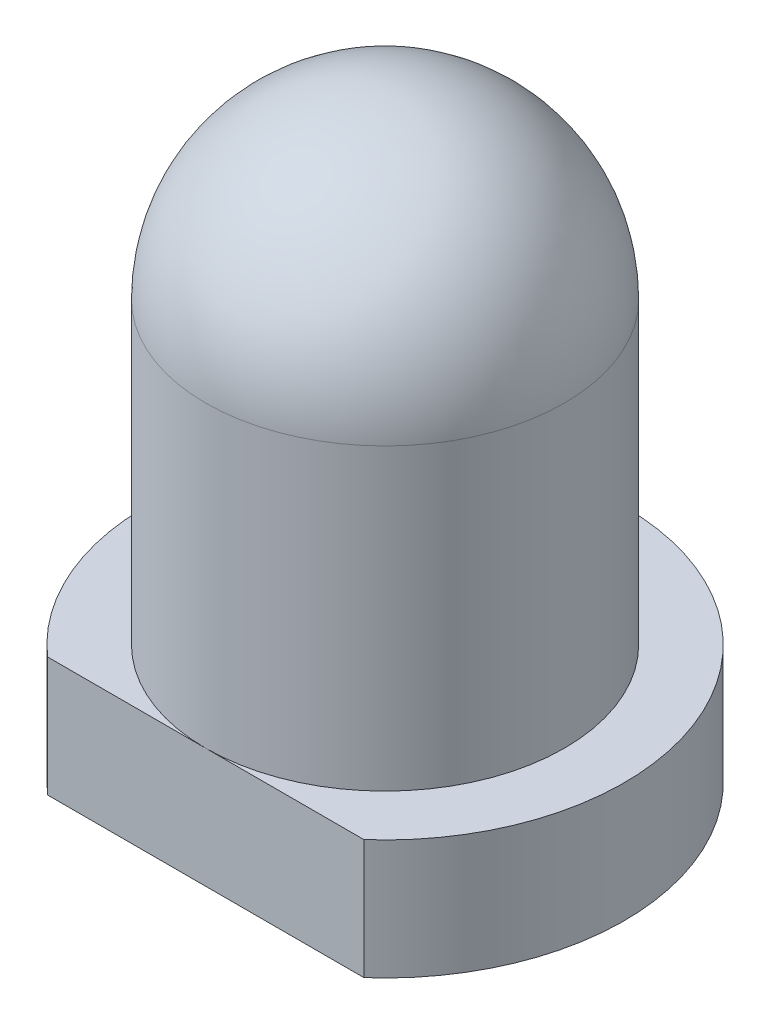
ISO-10303-21;
HEADER;
FILE_DESCRIPTION(('STEP AP214'),'2;1');
FILE_NAME('part.step','',(''),(''),'','','');
FILE_SCHEMA(('AUTOMOTIVE_DESIGN { 1 0 10303 214 1 1 1 1 }'));
ENDSEC;
DATA;
#1=APPLICATION_CONTEXT('core data for automotive mechanical design processes');
#2=APPLICATION_PROTOCOL_DEFINITION('international standard','automotive_design',2000,#1);
#3=PRODUCT_CONTEXT('',#1,'mechanical');
#4=PRODUCT('Part','Part','',(#3));
#5=PRODUCT_RELATED_PRODUCT_CATEGORY('part','',(#4));
#6=PRODUCT_DEFINITION_FORMATION('','',#4);
#7=PRODUCT_DEFINITION_CONTEXT('part definition',#1,'design');
#8=PRODUCT_DEFINITION('design','',#6,#7);
#9=PRODUCT_DEFINITION_SHAPE('','',#8);
#10=(LENGTH_UNIT() NAMED_UNIT(*) SI_UNIT(.MILLI.,.METRE.));
#11=(NAMED_UNIT(*) PLANE_ANGLE_UNIT() SI_UNIT($,.RADIAN.));
#12=(NAMED_UNIT(*) SI_UNIT($,.STERADIAN.) SOLID_ANGLE_UNIT());
#13=UNCERTAINTY_MEASURE_WITH_UNIT(LENGTH_MEASURE(1.E-05),#10,'distance_accuracy_value','');
#14=(GEOMETRIC_REPRESENTATION_CONTEXT(3) GLOBAL_UNCERTAINTY_ASSIGNED_CONTEXT((#13)) GLOBAL_UNIT_ASSIGNED_CONTEXT((#10,
#11,#12)) REPRESENTATION_CONTEXT('',''));
#15=CARTESIAN_POINT('',(0.,0.,0.));
#16=DIRECTION('',(0.,0.,1.));
#17=DIRECTION('',(1.,0.,0.));
#18=AXIS2_PLACEMENT_3D('',#15,#16,#17);
#19=CARTESIAN_POINT('',(0.,5.,0.));
#20=DIRECTION('',(0.,-1.,0.));
#21=DIRECTION('',(0.,0.,-1.));
#22=AXIS2_PLACEMENT_3D('',#19,#20,#21);
#23=CYLINDRICAL_SURFACE('',#22,1.5);
#24=CARTESIAN_POINT('',(0.,1.,0.));
#25=DIRECTION('',(0.,1.,0.));
#26=DIRECTION('',(0.,0.,1.));
#27=AXIS2_PLACEMENT_3D('',#24,#25,#26);
#28=CIRCLE('',#27,1.5);
#29=CARTESIAN_POINT('',(0.,1.,1.5));
#30=VERTEX_POINT('',#29);
#31=EDGE_CURVE('E11',#30,#30,#28,.T.);
#32=ORIENTED_EDGE('',*,*,#31,.T.);
#33=EDGE_LOOP('',(#32));
#34=FACE_BOUND('',#33,.T.);
#35=CARTESIAN_POINT('',(0.,3.5,0.));
#36=DIRECTION('',(0.,-1.,0.));
#37=DIRECTION('',(0.,0.,-1.));
#38=AXIS2_PLACEMENT_3D('',#35,#36,#37);
#39=CIRCLE('',#38,1.5);
#40=CARTESIAN_POINT('',(0.,3.5,-1.5));
#41=VERTEX_POINT('',#40);
#42=EDGE_CURVE('E41',#41,#41,#39,.T.);
#43=ORIENTED_EDGE('',*,*,#42,.T.);
#44=EDGE_LOOP('',(#43));
#45=FACE_BOUND('',#44,.T.);
#46=ADVANCED_FACE('F33',(#34,#45),#23,.T.);
#47=CARTESIAN_POINT('',(0.,3.5,0.));
#48=DIRECTION('',(0.,0.,1.));
#49=DIRECTION('',(1.,0.,0.));
#50=AXIS2_PLACEMENT_3D('',#47,#48,#49);
#51=SPHERICAL_SURFACE('',#50,1.5);
#52=CARTESIAN_POINT('',(0.,3.5,0.));
#53=DIRECTION('',(0.,-1.,0.));
#54=DIRECTION('',(0.,0.,-1.));
#55=AXIS2_PLACEMENT_3D('',#52,#53,#54);
#56=SPHERICAL_SURFACE('',#55,1.5);
#57=ORIENTED_EDGE('',*,*,#42,.F.);
#58=EDGE_LOOP('',(#57));
#59=FACE_BOUND('',#58,.T.);
#60=ADVANCED_FACE('F35',(#59),#56,.T.);
#61=CARTESIAN_POINT('',(0.,1.,0.));
#62=DIRECTION('',(0.,1.,0.));
#63=DIRECTION('',(0.,0.,1.));
#64=AXIS2_PLACEMENT_3D('',#61,#62,#63);
#65=PLANE('',#64);
#66=DIRECTION('',(1.,0.,0.));
#67=VECTOR('',#66,1.);
#68=CARTESIAN_POINT('',(1.32287565553229,1.,1.5));
#69=LINE('',#68,#67);
#70=CARTESIAN_POINT('',(-1.32287565553229,1.,1.5));
#71=VERTEX_POINT('',#70);
#72=EDGE_CURVE('E48',#71,#30,#69,.T.);
#73=ORIENTED_EDGE('',*,*,#72,.T.);
#74=ORIENTED_EDGE('',*,*,#31,.F.);
#75=CARTESIAN_POINT('',(1.32287565553229,1.,1.5));
#76=VERTEX_POINT('',#75);
#77=EDGE_CURVE('E53',#30,#76,#69,.T.);
#78=ORIENTED_EDGE('',*,*,#77,.T.);
#79=CARTESIAN_POINT('',(0.,1.,0.));
#80=DIRECTION('',(0.,1.,0.));
#81=DIRECTION('',(0.,0.,1.));
#82=AXIS2_PLACEMENT_3D('',#79,#80,#81);
#83=CIRCLE('',#82,2.);
#84=EDGE_CURVE('E73',#76,#71,#83,.T.);
#85=ORIENTED_EDGE('',*,*,#84,.T.);
#86=EDGE_LOOP('',(#73,#74,#78,#85));
#87=FACE_BOUND('',#86,.T.);
#88=ADVANCED_FACE('F89',(#87),#65,.T.);
#89=CARTESIAN_POINT('',(1.32287565553229,1.,1.5));
#90=DIRECTION('',(0.,0.,-1.));
#91=DIRECTION('',(-1.,0.,0.));
#92=AXIS2_PLACEMENT_3D('',#89,#90,#91);
#93=PLANE('',#92);
#94=ORIENTED_EDGE('',*,*,#77,.F.);
#95=ORIENTED_EDGE('',*,*,#72,.F.);
#96=DIRECTION('',(0.,-1.,0.));
#97=VECTOR('',#96,1.);
#98=CARTESIAN_POINT('',(-1.32287565553229,1.,1.5));
#99=LINE('',#98,#97);
#100=CARTESIAN_POINT('',(-1.32287565553229,0.,1.5));
#101=VERTEX_POINT('',#100);
#102=EDGE_CURVE('E69',#71,#101,#99,.T.);
#103=ORIENTED_EDGE('',*,*,#102,.T.);
#104=DIRECTION('',(1.,0.,0.));
#105=VECTOR('',#104,1.);
#106=CARTESIAN_POINT('',(1.32287565553229,0.,1.5));
#107=LINE('',#106,#105);
#108=CARTESIAN_POINT('',(1.32287565553229,0.,1.5));
#109=VERTEX_POINT('',#108);
#110=EDGE_CURVE('E63',#101,#109,#107,.T.);
#111=ORIENTED_EDGE('',*,*,#110,.T.);
#112=DIRECTION('',(0.,-1.,0.));
#113=VECTOR('',#112,1.);
#114=CARTESIAN_POINT('',(1.32287565553229,1.,1.5));
#115=LINE('',#114,#113);
#116=EDGE_CURVE('E66',#76,#109,#115,.T.);
#117=ORIENTED_EDGE('',*,*,#116,.F.);
#118=EDGE_LOOP('',(#94,#95,#103,#111,#117));
#119=FACE_BOUND('',#118,.T.);
#120=ADVANCED_FACE('F65',(#119),#93,.F.);
#121=CARTESIAN_POINT('',(0.,1.,0.));
#122=DIRECTION('',(0.,-1.,0.));
#123=DIRECTION('',(0.,0.,-1.));
#124=AXIS2_PLACEMENT_3D('',#121,#122,#123);
#125=CYLINDRICAL_SURFACE('',#124,2.);
#126=CARTESIAN_POINT('',(0.,0.,0.));
#127=DIRECTION('',(0.,1.,0.));
#128=DIRECTION('',(0.,0.,1.));
#129=AXIS2_PLACEMENT_3D('',#126,#127,#128);
#130=CIRCLE('',#129,2.);
#131=EDGE_CURVE('E74',#109,#101,#130,.T.);
#132=ORIENTED_EDGE('',*,*,#131,.T.);
#133=ORIENTED_EDGE('',*,*,#102,.F.);
#134=ORIENTED_EDGE('',*,*,#84,.F.);
#135=ORIENTED_EDGE('',*,*,#116,.T.);
#136=EDGE_LOOP('',(#132,#133,#134,#135));
#137=FACE_BOUND('',#136,.T.);
#138=ADVANCED_FACE('F77',(#137),#125,.T.);
#139=CARTESIAN_POINT('',(0.,0.,0.));
#140=DIRECTION('',(0.,1.,0.));
#141=DIRECTION('',(0.,0.,1.));
#142=AXIS2_PLACEMENT_3D('',#139,#140,#141);
#143=PLANE('',#142);
#144=ORIENTED_EDGE('',*,*,#110,.F.);
#145=ORIENTED_EDGE('',*,*,#131,.F.);
#146=EDGE_LOOP('',(#144,#145));
#147=FACE_BOUND('',#146,.T.);
#148=ADVANCED_FACE('F79',(#147),#143,.F.);
#149=CLOSED_SHELL('',(#46,#60,#88,#120,#138,#148));
#150=MANIFOLD_SOLID_BREP('B2',#149);
#151=ADVANCED_BREP_SHAPE_REPRESENTATION('',(#18,#150),#14);
#152=SHAPE_DEFINITION_REPRESENTATION(#9,#151);
ENDSEC;
END-ISO-10303-21;
